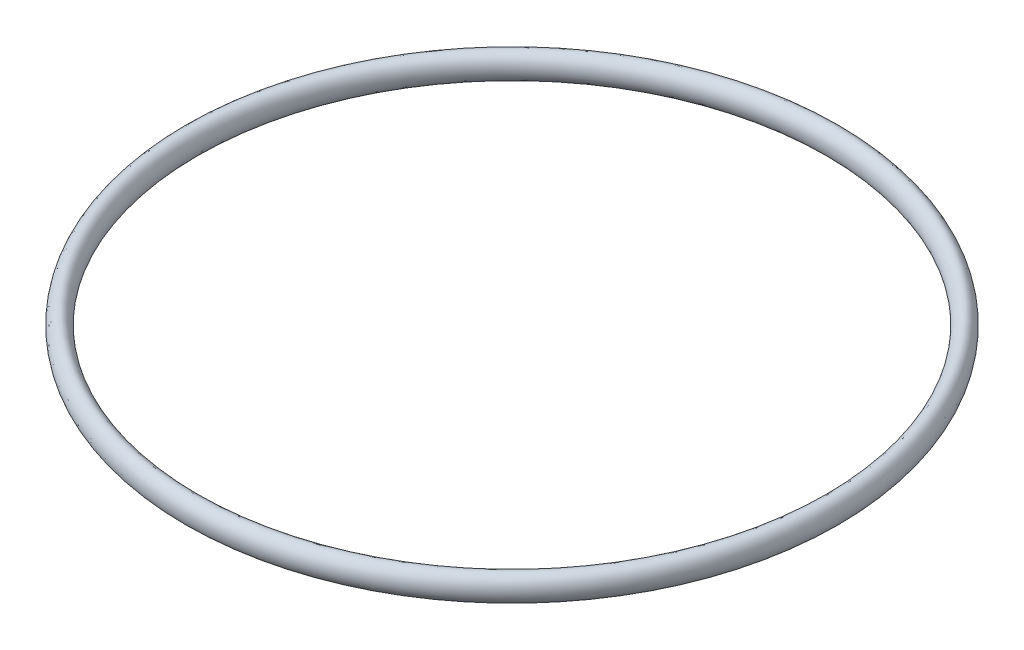
ISO-10303-21;
HEADER;
FILE_DESCRIPTION(('STEP AP214'),'2;1');
FILE_NAME('part.step','',(''),(''),'','','');
FILE_SCHEMA(('AUTOMOTIVE_DESIGN { 1 0 10303 214 1 1 1 1 }'));
ENDSEC;
DATA;
#1=APPLICATION_CONTEXT('core data for automotive mechanical design processes');
#2=APPLICATION_PROTOCOL_DEFINITION('international standard','automotive_design',2000,#1);
#3=PRODUCT_CONTEXT('',#1,'mechanical');
#4=PRODUCT('Part','Part','',(#3));
#5=PRODUCT_RELATED_PRODUCT_CATEGORY('part','',(#4));
#6=PRODUCT_DEFINITION_FORMATION('','',#4);
#7=PRODUCT_DEFINITION_CONTEXT('part definition',#1,'design');
#8=PRODUCT_DEFINITION('design','',#6,#7);
#9=PRODUCT_DEFINITION_SHAPE('','',#8);
#10=(LENGTH_UNIT() NAMED_UNIT(*) SI_UNIT(.MILLI.,.METRE.));
#11=(NAMED_UNIT(*) PLANE_ANGLE_UNIT() SI_UNIT($,.RADIAN.));
#12=(NAMED_UNIT(*) SI_UNIT($,.STERADIAN.) SOLID_ANGLE_UNIT());
#13=UNCERTAINTY_MEASURE_WITH_UNIT(LENGTH_MEASURE(1.E-05),#10,'distance_accuracy_value','');
#14=(GEOMETRIC_REPRESENTATION_CONTEXT(3) GLOBAL_UNCERTAINTY_ASSIGNED_CONTEXT((#13)) GLOBAL_UNIT_ASSIGNED_CONTEXT((#10,
#11,#12)) REPRESENTATION_CONTEXT('',''));
#15=CARTESIAN_POINT('',(0.,0.,0.));
#16=DIRECTION('',(0.,0.,1.));
#17=DIRECTION('',(1.,0.,0.));
#18=AXIS2_PLACEMENT_3D('',#15,#16,#17);
#19=CARTESIAN_POINT('',(0.,0.,-49.25));
#20=DIRECTION('',(1.,0.,0.));
#21=DIRECTION('',(0.,-1.,0.));
#22=AXIS2_PLACEMENT_3D('',#19,#20,#21);
#23=ELLIPSE('',#22,2.,1.5);
#24=CARTESIAN_POINT('',(0.,4.51546391752577,0.));
#25=DIRECTION('',(0.,1.,0.));
#26=AXIS1_PLACEMENT('',#24,#25);
#27=SURFACE_OF_REVOLUTION('',#23,#26);
#28=ADVANCED_FACE('F38',(),#27,.T.);
#29=CLOSED_SHELL('',(#28));
#30=MANIFOLD_SOLID_BREP('B2',#29);
#31=ADVANCED_BREP_SHAPE_REPRESENTATION('',(#18,#30),#14);
#32=SHAPE_DEFINITION_REPRESENTATION(#9,#31);
ENDSEC;
END-ISO-10303-21;
